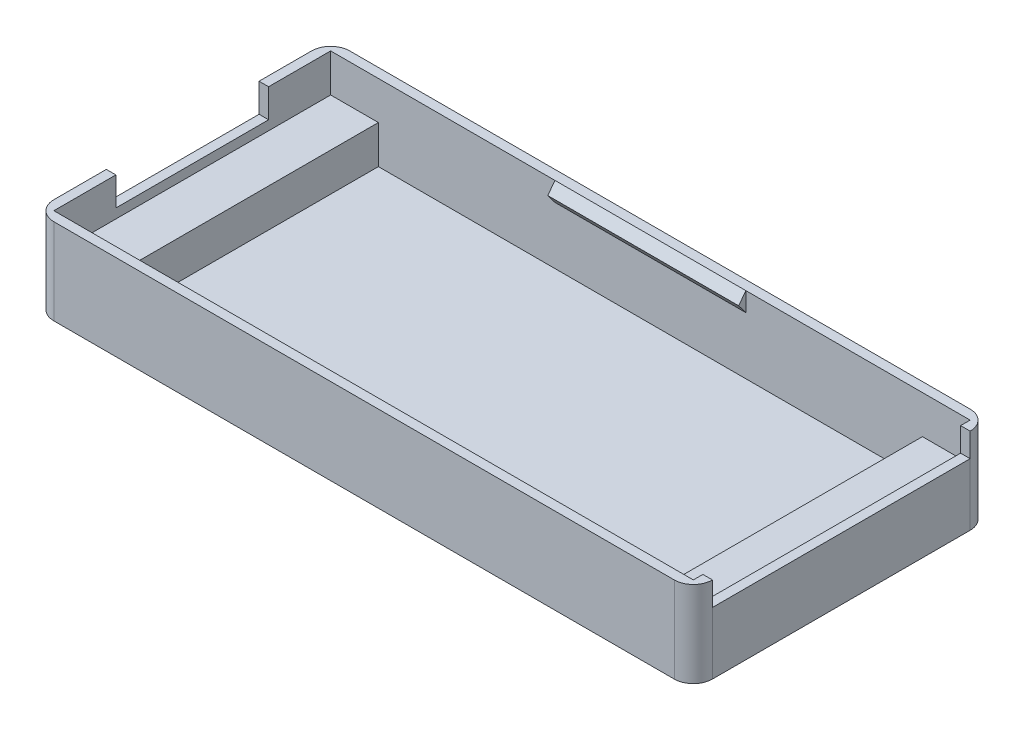
ISO-10303-21;
HEADER;
FILE_DESCRIPTION(('STEP AP214'),'2;1');
FILE_NAME('part.step','',(''),(''),'','','');
FILE_SCHEMA(('AUTOMOTIVE_DESIGN { 1 0 10303 214 1 1 1 1 }'));
ENDSEC;
DATA;
#1=APPLICATION_CONTEXT('core data for automotive mechanical design processes');
#2=APPLICATION_PROTOCOL_DEFINITION('international standard','automotive_design',2000,#1);
#3=PRODUCT_CONTEXT('',#1,'mechanical');
#4=PRODUCT('Part','Part','',(#3));
#5=PRODUCT_RELATED_PRODUCT_CATEGORY('part','',(#4));
#6=PRODUCT_DEFINITION_FORMATION('','',#4);
#7=PRODUCT_DEFINITION_CONTEXT('part definition',#1,'design');
#8=PRODUCT_DEFINITION('design','',#6,#7);
#9=PRODUCT_DEFINITION_SHAPE('','',#8);
#10=(LENGTH_UNIT() NAMED_UNIT(*) SI_UNIT(.MILLI.,.METRE.));
#11=(NAMED_UNIT(*) PLANE_ANGLE_UNIT() SI_UNIT($,.RADIAN.));
#12=(NAMED_UNIT(*) SI_UNIT($,.STERADIAN.) SOLID_ANGLE_UNIT());
#13=UNCERTAINTY_MEASURE_WITH_UNIT(LENGTH_MEASURE(1.E-05),#10,'distance_accuracy_value','');
#14=(GEOMETRIC_REPRESENTATION_CONTEXT(3) GLOBAL_UNCERTAINTY_ASSIGNED_CONTEXT((#13)) GLOBAL_UNIT_ASSIGNED_CONTEXT((#10,
#11,#12)) REPRESENTATION_CONTEXT('',''));
#15=CARTESIAN_POINT('',(0.,0.,0.));
#16=DIRECTION('',(0.,0.,1.));
#17=DIRECTION('',(1.,0.,0.));
#18=AXIS2_PLACEMENT_3D('',#15,#16,#17);
#19=CARTESIAN_POINT('',(-33.5,5.,-14.5));
#20=DIRECTION('',(0.,0.,-1.));
#21=DIRECTION('',(-1.,0.,0.));
#22=AXIS2_PLACEMENT_3D('',#19,#20,#21);
#23=PLANE('',#22);
#24=DIRECTION('',(0.,1.,0.));
#25=VECTOR('',#24,1.);
#26=CARTESIAN_POINT('',(10.,7.00000000000003,-14.5));
#27=LINE('',#26,#25);
#28=CARTESIAN_POINT('',(10.,7.00000000000003,-14.5));
#29=VERTEX_POINT('',#28);
#30=CARTESIAN_POINT('',(10.,9.,-14.5));
#31=VERTEX_POINT('',#30);
#32=EDGE_CURVE('E230',#29,#31,#27,.T.);
#33=ORIENTED_EDGE('',*,*,#32,.F.);
#34=DIRECTION('',(-1.,0.,0.));
#35=VECTOR('',#34,1.);
#36=CARTESIAN_POINT('',(10.,7.00000000000003,-14.5));
#37=LINE('',#36,#35);
#38=CARTESIAN_POINT('',(-10.,7.00000000000003,-14.5));
#39=VERTEX_POINT('',#38);
#40=EDGE_CURVE('E239',#29,#39,#37,.T.);
#41=ORIENTED_EDGE('',*,*,#40,.T.);
#42=DIRECTION('',(0.,1.,0.));
#43=VECTOR('',#42,1.);
#44=CARTESIAN_POINT('',(-10.,7.00000000000003,-14.5));
#45=LINE('',#44,#43);
#46=CARTESIAN_POINT('',(-10.,9.,-14.5));
#47=VERTEX_POINT('',#46);
#48=EDGE_CURVE('E256',#39,#47,#45,.T.);
#49=ORIENTED_EDGE('',*,*,#48,.T.);
#50=DIRECTION('',(-1.,0.,0.));
#51=VECTOR('',#50,1.);
#52=CARTESIAN_POINT('',(-33.5,9.,-14.5));
#53=LINE('',#52,#51);
#54=CARTESIAN_POINT('',(-33.5,9.,-14.5));
#55=VERTEX_POINT('',#54);
#56=EDGE_CURVE('E373',#47,#55,#53,.T.);
#57=ORIENTED_EDGE('',*,*,#56,.T.);
#58=DIRECTION('',(0.,1.,0.));
#59=VECTOR('',#58,1.);
#60=CARTESIAN_POINT('',(-33.5,5.,-14.5));
#61=LINE('',#60,#59);
#62=CARTESIAN_POINT('',(-33.5,5.,-14.5));
#63=VERTEX_POINT('',#62);
#64=EDGE_CURVE('E389',#63,#55,#61,.T.);
#65=ORIENTED_EDGE('',*,*,#64,.F.);
#66=DIRECTION('',(-1.,0.,0.));
#67=VECTOR('',#66,1.);
#68=CARTESIAN_POINT('',(-33.5,5.,-14.5));
#69=LINE('',#68,#67);
#70=CARTESIAN_POINT('',(-28.5,5.,-14.5));
#71=VERTEX_POINT('',#70);
#72=EDGE_CURVE('E357',#71,#63,#69,.T.);
#73=ORIENTED_EDGE('',*,*,#72,.F.);
#74=DIRECTION('',(0.,1.,0.));
#75=VECTOR('',#74,1.);
#76=CARTESIAN_POINT('',(-28.5,0.999999999999999,-14.5));
#77=LINE('',#76,#75);
#78=CARTESIAN_POINT('',(-28.5,0.999999999999999,-14.5));
#79=VERTEX_POINT('',#78);
#80=EDGE_CURVE('E326',#79,#71,#77,.T.);
#81=ORIENTED_EDGE('',*,*,#80,.F.);
#82=DIRECTION('',(-1.,0.,0.));
#83=VECTOR('',#82,1.);
#84=CARTESIAN_POINT('',(-28.5,0.999999999999999,-14.5));
#85=LINE('',#84,#83);
#86=CARTESIAN_POINT('',(28.5,0.999999999999999,-14.5));
#87=VERTEX_POINT('',#86);
#88=EDGE_CURVE('E318',#87,#79,#85,.T.);
#89=ORIENTED_EDGE('',*,*,#88,.F.);
#90=DIRECTION('',(0.,1.,0.));
#91=VECTOR('',#90,1.);
#92=CARTESIAN_POINT('',(28.5,0.999999999999999,-14.5));
#93=LINE('',#92,#91);
#94=CARTESIAN_POINT('',(28.5,5.,-14.5));
#95=VERTEX_POINT('',#94);
#96=EDGE_CURVE('E329',#87,#95,#93,.T.);
#97=ORIENTED_EDGE('',*,*,#96,.T.);
#98=CARTESIAN_POINT('',(33.5,5.,-14.5));
#99=VERTEX_POINT('',#98);
#100=EDGE_CURVE('E359',#99,#95,#69,.T.);
#101=ORIENTED_EDGE('',*,*,#100,.F.);
#102=DIRECTION('',(0.,1.,0.));
#103=VECTOR('',#102,1.);
#104=CARTESIAN_POINT('',(33.5,5.,-14.5));
#105=LINE('',#104,#103);
#106=CARTESIAN_POINT('',(33.5,9.,-14.5));
#107=VERTEX_POINT('',#106);
#108=EDGE_CURVE('E369',#99,#107,#105,.T.);
#109=ORIENTED_EDGE('',*,*,#108,.T.);
#110=EDGE_CURVE('E250',#107,#31,#53,.T.);
#111=ORIENTED_EDGE('',*,*,#110,.T.);
#112=EDGE_LOOP('',(#33,#41,#49,#57,#65,#73,#81,#89,#97,#101,#109,#111));
#113=FACE_BOUND('',#112,.T.);
#114=ADVANCED_FACE('F36',(#113),#23,.F.);
#115=CARTESIAN_POINT('',(-33.5,5.,14.5));
#116=DIRECTION('',(0.,0.,1.));
#117=DIRECTION('',(1.,0.,0.));
#118=AXIS2_PLACEMENT_3D('',#115,#116,#117);
#119=PLANE('',#118);
#120=DIRECTION('',(0.,-1.,0.));
#121=VECTOR('',#120,1.);
#122=CARTESIAN_POINT('',(10.,7.00000000000003,14.5));
#123=LINE('',#122,#121);
#124=CARTESIAN_POINT('',(10.,9.,14.5));
#125=VERTEX_POINT('',#124);
#126=CARTESIAN_POINT('',(10.,7.00000000000003,14.5));
#127=VERTEX_POINT('',#126);
#128=EDGE_CURVE('E263',#125,#127,#123,.T.);
#129=ORIENTED_EDGE('',*,*,#128,.F.);
#130=DIRECTION('',(1.,0.,0.));
#131=VECTOR('',#130,1.);
#132=CARTESIAN_POINT('',(-33.5,9.,14.5));
#133=LINE('',#132,#131);
#134=CARTESIAN_POINT('',(33.5,9.,14.5));
#135=VERTEX_POINT('',#134);
#136=EDGE_CURVE('E379',#125,#135,#133,.T.);
#137=ORIENTED_EDGE('',*,*,#136,.T.);
#138=DIRECTION('',(0.,1.,0.));
#139=VECTOR('',#138,1.);
#140=CARTESIAN_POINT('',(33.5,5.,14.5));
#141=LINE('',#140,#139);
#142=CARTESIAN_POINT('',(33.5,5.,14.5));
#143=VERTEX_POINT('',#142);
#144=EDGE_CURVE('E382',#143,#135,#141,.T.);
#145=ORIENTED_EDGE('',*,*,#144,.F.);
#146=DIRECTION('',(1.,0.,0.));
#147=VECTOR('',#146,1.);
#148=CARTESIAN_POINT('',(-33.5,5.,14.5));
#149=LINE('',#148,#147);
#150=CARTESIAN_POINT('',(28.5,5.,14.5));
#151=VERTEX_POINT('',#150);
#152=EDGE_CURVE('E365',#151,#143,#149,.T.);
#153=ORIENTED_EDGE('',*,*,#152,.F.);
#154=DIRECTION('',(0.,1.,0.));
#155=VECTOR('',#154,1.);
#156=CARTESIAN_POINT('',(28.5,0.999999999999999,14.5));
#157=LINE('',#156,#155);
#158=CARTESIAN_POINT('',(28.5,0.999999999999999,14.5));
#159=VERTEX_POINT('',#158);
#160=EDGE_CURVE('E331',#159,#151,#157,.T.);
#161=ORIENTED_EDGE('',*,*,#160,.F.);
#162=DIRECTION('',(1.,0.,0.));
#163=VECTOR('',#162,1.);
#164=CARTESIAN_POINT('',(-28.5,0.999999999999999,14.5));
#165=LINE('',#164,#163);
#166=CARTESIAN_POINT('',(-28.5,0.999999999999999,14.5));
#167=VERTEX_POINT('',#166);
#168=EDGE_CURVE('E311',#167,#159,#165,.T.);
#169=ORIENTED_EDGE('',*,*,#168,.F.);
#170=DIRECTION('',(0.,1.,0.));
#171=VECTOR('',#170,1.);
#172=CARTESIAN_POINT('',(-28.5,0.999999999999999,14.5));
#173=LINE('',#172,#171);
#174=CARTESIAN_POINT('',(-28.5,5.,14.5));
#175=VERTEX_POINT('',#174);
#176=EDGE_CURVE('E321',#167,#175,#173,.T.);
#177=ORIENTED_EDGE('',*,*,#176,.T.);
#178=CARTESIAN_POINT('',(-33.5,5.,14.5));
#179=VERTEX_POINT('',#178);
#180=EDGE_CURVE('E366',#179,#175,#149,.T.);
#181=ORIENTED_EDGE('',*,*,#180,.F.);
#182=DIRECTION('',(0.,1.,0.));
#183=VECTOR('',#182,1.);
#184=CARTESIAN_POINT('',(-33.5,5.,14.5));
#185=LINE('',#184,#183);
#186=CARTESIAN_POINT('',(-33.5,9.,14.5));
#187=VERTEX_POINT('',#186);
#188=EDGE_CURVE('E386',#179,#187,#185,.T.);
#189=ORIENTED_EDGE('',*,*,#188,.T.);
#190=CARTESIAN_POINT('',(-10.,9.,14.5));
#191=VERTEX_POINT('',#190);
#192=EDGE_CURVE('E358',#187,#191,#133,.T.);
#193=ORIENTED_EDGE('',*,*,#192,.T.);
#194=DIRECTION('',(0.,-1.,0.));
#195=VECTOR('',#194,1.);
#196=CARTESIAN_POINT('',(-10.,7.00000000000003,14.5));
#197=LINE('',#196,#195);
#198=CARTESIAN_POINT('',(-10.,7.00000000000003,14.5));
#199=VERTEX_POINT('',#198);
#200=EDGE_CURVE('E270',#191,#199,#197,.T.);
#201=ORIENTED_EDGE('',*,*,#200,.T.);
#202=DIRECTION('',(-1.,0.,0.));
#203=VECTOR('',#202,1.);
#204=CARTESIAN_POINT('',(10.,7.00000000000003,14.5));
#205=LINE('',#204,#203);
#206=EDGE_CURVE('E276',#127,#199,#205,.T.);
#207=ORIENTED_EDGE('',*,*,#206,.F.);
#208=EDGE_LOOP('',(#129,#137,#145,#153,#161,#169,#177,#181,#189,#193,#201,#207));
#209=FACE_BOUND('',#208,.T.);
#210=ADVANCED_FACE('F521',(#209),#119,.F.);
#211=CARTESIAN_POINT('',(-32.5,9.,13.5));
#212=DIRECTION('',(0.,-1.,0.));
#213=DIRECTION('',(0.,0.,-1.));
#214=AXIS2_PLACEMENT_3D('',#211,#212,#213);
#215=PLANE('',#214);
#216=DIRECTION('',(0.,0.,1.));
#217=VECTOR('',#216,1.);
#218=CARTESIAN_POINT('',(-33.5,9.,14.5));
#219=LINE('',#218,#217);
#220=CARTESIAN_POINT('',(-33.5,9.,8.));
#221=VERTEX_POINT('',#220);
#222=EDGE_CURVE('E375',#221,#187,#219,.T.);
#223=ORIENTED_EDGE('',*,*,#222,.F.);
#224=DIRECTION('',(1.,0.,0.));
#225=VECTOR('',#224,1.);
#226=CARTESIAN_POINT('',(-37.5,9.,8.));
#227=LINE('',#226,#225);
#228=CARTESIAN_POINT('',(-34.5,9.,8.));
#229=VERTEX_POINT('',#228);
#230=EDGE_CURVE('E289',#229,#221,#227,.T.);
#231=ORIENTED_EDGE('',*,*,#230,.F.);
#232=DIRECTION('',(0.,0.,1.));
#233=VECTOR('',#232,1.);
#234=CARTESIAN_POINT('',(-34.5,9.,13.5));
#235=LINE('',#234,#233);
#236=CARTESIAN_POINT('',(-34.5,9.,13.5));
#237=VERTEX_POINT('',#236);
#238=EDGE_CURVE('E408',#229,#237,#235,.T.);
#239=ORIENTED_EDGE('',*,*,#238,.T.);
#240=CARTESIAN_POINT('',(-32.5,9.,13.5));
#241=DIRECTION('',(0.,1.,0.));
#242=DIRECTION('',(0.,0.,-1.));
#243=AXIS2_PLACEMENT_3D('',#240,#241,#242);
#244=CIRCLE('',#243,2.);
#245=CARTESIAN_POINT('',(-32.5,9.,15.5));
#246=VERTEX_POINT('',#245);
#247=EDGE_CURVE('E393',#237,#246,#244,.T.);
#248=ORIENTED_EDGE('',*,*,#247,.T.);
#249=DIRECTION('',(1.,0.,0.));
#250=VECTOR('',#249,1.);
#251=CARTESIAN_POINT('',(-32.5,9.,15.5));
#252=LINE('',#251,#250);
#253=CARTESIAN_POINT('',(32.5,9.,15.5));
#254=VERTEX_POINT('',#253);
#255=EDGE_CURVE('E396',#246,#254,#252,.T.);
#256=ORIENTED_EDGE('',*,*,#255,.T.);
#257=CARTESIAN_POINT('',(32.5,9.,13.5));
#258=DIRECTION('',(0.,1.,0.));
#259=DIRECTION('',(0.,0.,1.));
#260=AXIS2_PLACEMENT_3D('',#257,#258,#259);
#261=CIRCLE('',#260,1.99999999999999);
#262=CARTESIAN_POINT('',(34.5,9.,13.5));
#263=VERTEX_POINT('',#262);
#264=EDGE_CURVE('E399',#254,#263,#261,.T.);
#265=ORIENTED_EDGE('',*,*,#264,.T.);
#266=DIRECTION('',(-1.,0.,0.));
#267=VECTOR('',#266,1.);
#268=CARTESIAN_POINT('',(52.5,9.,13.5));
#269=LINE('',#268,#267);
#270=CARTESIAN_POINT('',(33.5,9.,13.5));
#271=VERTEX_POINT('',#270);
#272=EDGE_CURVE('E344',#263,#271,#269,.T.);
#273=ORIENTED_EDGE('',*,*,#272,.T.);
#274=DIRECTION('',(0.,0.,-1.));
#275=VECTOR('',#274,1.);
#276=CARTESIAN_POINT('',(33.5,9.,14.5));
#277=LINE('',#276,#275);
#278=EDGE_CURVE('E370',#135,#271,#277,.T.);
#279=ORIENTED_EDGE('',*,*,#278,.F.);
#280=ORIENTED_EDGE('',*,*,#136,.F.);
#281=DIRECTION('',(-1.,0.,0.));
#282=VECTOR('',#281,1.);
#283=CARTESIAN_POINT('',(10.,9.,14.5));
#284=LINE('',#283,#282);
#285=EDGE_CURVE('E278',#125,#191,#284,.T.);
#286=ORIENTED_EDGE('',*,*,#285,.T.);
#287=ORIENTED_EDGE('',*,*,#192,.F.);
#288=EDGE_LOOP('',(#223,#231,#239,#248,#256,#265,#273,#279,#280,#286,#287));
#289=FACE_BOUND('',#288,.T.);
#290=ADVANCED_FACE('F479',(#289),#215,.F.);
#291=CARTESIAN_POINT('',(0.,5.,0.));
#292=DIRECTION('',(0.,-1.,0.));
#293=DIRECTION('',(0.,0.,-1.));
#294=AXIS2_PLACEMENT_3D('',#291,#292,#293);
#295=PLANE('',#294);
#296=DIRECTION('',(0.,0.,1.));
#297=VECTOR('',#296,1.);
#298=CARTESIAN_POINT('',(-28.5,5.,-14.5));
#299=LINE('',#298,#297);
#300=EDGE_CURVE('E307',#71,#175,#299,.T.);
#301=ORIENTED_EDGE('',*,*,#300,.F.);
#302=ORIENTED_EDGE('',*,*,#72,.T.);
#303=DIRECTION('',(0.,0.,1.));
#304=VECTOR('',#303,1.);
#305=CARTESIAN_POINT('',(-33.5,5.,14.5));
#306=LINE('',#305,#304);
#307=EDGE_CURVE('E362',#63,#179,#306,.T.);
#308=ORIENTED_EDGE('',*,*,#307,.T.);
#309=ORIENTED_EDGE('',*,*,#180,.T.);
#310=EDGE_LOOP('',(#301,#302,#308,#309));
#311=FACE_BOUND('',#310,.T.);
#312=ADVANCED_FACE('F535',(#311),#295,.F.);
#313=DIRECTION('',(0.,0.,-1.));
#314=VECTOR('',#313,1.);
#315=CARTESIAN_POINT('',(28.5,5.,-14.5));
#316=LINE('',#315,#314);
#317=EDGE_CURVE('E312',#151,#95,#316,.T.);
#318=ORIENTED_EDGE('',*,*,#317,.F.);
#319=ORIENTED_EDGE('',*,*,#152,.T.);
#320=DIRECTION('',(0.,0.,-1.));
#321=VECTOR('',#320,1.);
#322=CARTESIAN_POINT('',(33.5,5.,14.5));
#323=LINE('',#322,#321);
#324=EDGE_CURVE('E354',#143,#99,#323,.T.);
#325=ORIENTED_EDGE('',*,*,#324,.T.);
#326=ORIENTED_EDGE('',*,*,#100,.T.);
#327=EDGE_LOOP('',(#318,#319,#325,#326));
#328=FACE_BOUND('',#327,.T.);
#329=ADVANCED_FACE('F516',(#328),#295,.F.);
#330=CARTESIAN_POINT('',(-32.5,9.,13.5));
#331=DIRECTION('',(0.,-1.,0.));
#332=DIRECTION('',(0.,0.,-1.));
#333=AXIS2_PLACEMENT_3D('',#330,#331,#332);
#334=CYLINDRICAL_SURFACE('',#333,2.);
#335=CARTESIAN_POINT('',(-32.5,0.,13.5));
#336=DIRECTION('',(0.,1.,0.));
#337=DIRECTION('',(0.,0.,-1.));
#338=AXIS2_PLACEMENT_3D('',#335,#336,#337);
#339=CIRCLE('',#338,2.);
#340=CARTESIAN_POINT('',(-34.5,0.,13.5));
#341=VERTEX_POINT('',#340);
#342=CARTESIAN_POINT('',(-32.5,0.,15.5));
#343=VERTEX_POINT('',#342);
#344=EDGE_CURVE('E385',#341,#343,#339,.T.);
#345=ORIENTED_EDGE('',*,*,#344,.T.);
#346=DIRECTION('',(0.,-1.,0.));
#347=VECTOR('',#346,1.);
#348=CARTESIAN_POINT('',(-32.5,9.,15.5));
#349=LINE('',#348,#347);
#350=EDGE_CURVE('E11',#246,#343,#349,.T.);
#351=ORIENTED_EDGE('',*,*,#350,.F.);
#352=ORIENTED_EDGE('',*,*,#247,.F.);
#353=DIRECTION('',(0.,-1.,0.));
#354=VECTOR('',#353,1.);
#355=CARTESIAN_POINT('',(-34.5,9.,13.5));
#356=LINE('',#355,#354);
#357=EDGE_CURVE('E412',#237,#341,#356,.T.);
#358=ORIENTED_EDGE('',*,*,#357,.T.);
#359=EDGE_LOOP('',(#345,#351,#352,#358));
#360=FACE_BOUND('',#359,.T.);
#361=ADVANCED_FACE('F38',(#360),#334,.T.);
#362=CARTESIAN_POINT('',(-32.5,9.,15.5));
#363=DIRECTION('',(0.,0.,-1.));
#364=DIRECTION('',(-1.,0.,0.));
#365=AXIS2_PLACEMENT_3D('',#362,#363,#364);
#366=PLANE('',#365);
#367=DIRECTION('',(1.,0.,0.));
#368=VECTOR('',#367,1.);
#369=CARTESIAN_POINT('',(-32.5,0.,15.5));
#370=LINE('',#369,#368);
#371=CARTESIAN_POINT('',(32.5,0.,15.5));
#372=VERTEX_POINT('',#371);
#373=EDGE_CURVE('E415',#343,#372,#370,.T.);
#374=ORIENTED_EDGE('',*,*,#373,.T.);
#375=DIRECTION('',(0.,-1.,0.));
#376=VECTOR('',#375,1.);
#377=CARTESIAN_POINT('',(32.5,9.,15.5));
#378=LINE('',#377,#376);
#379=EDGE_CURVE('E44',#254,#372,#378,.T.);
#380=ORIENTED_EDGE('',*,*,#379,.F.);
#381=ORIENTED_EDGE('',*,*,#255,.F.);
#382=ORIENTED_EDGE('',*,*,#350,.T.);
#383=EDGE_LOOP('',(#374,#380,#381,#382));
#384=FACE_BOUND('',#383,.T.);
#385=ADVANCED_FACE('F483',(#384),#366,.F.);
#386=CARTESIAN_POINT('',(32.5,9.,13.5));
#387=DIRECTION('',(0.,-1.,0.));
#388=DIRECTION('',(0.,0.,-1.));
#389=AXIS2_PLACEMENT_3D('',#386,#387,#388);
#390=CYLINDRICAL_SURFACE('',#389,1.99999999999999);
#391=CARTESIAN_POINT('',(32.5,0.,13.5));
#392=DIRECTION('',(0.,1.,0.));
#393=DIRECTION('',(0.,0.,1.));
#394=AXIS2_PLACEMENT_3D('',#391,#392,#393);
#395=CIRCLE('',#394,1.99999999999999);
#396=CARTESIAN_POINT('',(34.5,0.,13.5));
#397=VERTEX_POINT('',#396);
#398=EDGE_CURVE('E417',#372,#397,#395,.T.);
#399=ORIENTED_EDGE('',*,*,#398,.T.);
#400=DIRECTION('',(0.,-1.,0.));
#401=VECTOR('',#400,1.);
#402=CARTESIAN_POINT('',(34.5,9.,13.5));
#403=LINE('',#402,#401);
#404=CARTESIAN_POINT('',(34.5,6.5,13.5));
#405=VERTEX_POINT('',#404);
#406=EDGE_CURVE('E445',#405,#397,#403,.T.);
#407=ORIENTED_EDGE('',*,*,#406,.F.);
#408=EDGE_CURVE('E446',#263,#405,#403,.T.);
#409=ORIENTED_EDGE('',*,*,#408,.F.);
#410=ORIENTED_EDGE('',*,*,#264,.F.);
#411=ORIENTED_EDGE('',*,*,#379,.T.);
#412=EDGE_LOOP('',(#399,#407,#409,#410,#411));
#413=FACE_BOUND('',#412,.T.);
#414=ADVANCED_FACE('F452',(#413),#390,.T.);
#415=CARTESIAN_POINT('',(34.5,9.,13.5));
#416=DIRECTION('',(-1.,0.,0.));
#417=DIRECTION('',(0.,0.,1.));
#418=AXIS2_PLACEMENT_3D('',#415,#416,#417);
#419=PLANE('',#418);
#420=DIRECTION('',(0.,-1.,0.));
#421=VECTOR('',#420,1.);
#422=CARTESIAN_POINT('',(34.5,9.,-13.5));
#423=LINE('',#422,#421);
#424=CARTESIAN_POINT('',(34.5,6.5,-13.5));
#425=VERTEX_POINT('',#424);
#426=CARTESIAN_POINT('',(34.5,0.,-13.5));
#427=VERTEX_POINT('',#426);
#428=EDGE_CURVE('E441',#425,#427,#423,.T.);
#429=ORIENTED_EDGE('',*,*,#428,.F.);
#430=DIRECTION('',(0.,0.,1.));
#431=VECTOR('',#430,1.);
#432=CARTESIAN_POINT('',(34.5,6.5,13.5));
#433=LINE('',#432,#431);
#434=EDGE_CURVE('E343',#425,#405,#433,.T.);
#435=ORIENTED_EDGE('',*,*,#434,.T.);
#436=ORIENTED_EDGE('',*,*,#406,.T.);
#437=DIRECTION('',(0.,0.,-1.));
#438=VECTOR('',#437,1.);
#439=CARTESIAN_POINT('',(34.5,0.,13.5));
#440=LINE('',#439,#438);
#441=EDGE_CURVE('E420',#397,#427,#440,.T.);
#442=ORIENTED_EDGE('',*,*,#441,.T.);
#443=EDGE_LOOP('',(#429,#435,#436,#442));
#444=FACE_BOUND('',#443,.T.);
#445=ADVANCED_FACE('F464',(#444),#419,.F.);
#446=CARTESIAN_POINT('',(32.5,9.,-13.5));
#447=DIRECTION('',(0.,-1.,0.));
#448=DIRECTION('',(0.,0.,-1.));
#449=AXIS2_PLACEMENT_3D('',#446,#447,#448);
#450=CYLINDRICAL_SURFACE('',#449,1.99999999999999);
#451=CARTESIAN_POINT('',(32.5,0.,-13.5));
#452=DIRECTION('',(0.,1.,0.));
#453=DIRECTION('',(0.,0.,-1.));
#454=AXIS2_PLACEMENT_3D('',#451,#452,#453);
#455=CIRCLE('',#454,1.99999999999999);
#456=CARTESIAN_POINT('',(32.5,0.,-15.5));
#457=VERTEX_POINT('',#456);
#458=EDGE_CURVE('E423',#427,#457,#455,.T.);
#459=ORIENTED_EDGE('',*,*,#458,.T.);
#460=DIRECTION('',(0.,-1.,0.));
#461=VECTOR('',#460,1.);
#462=CARTESIAN_POINT('',(32.5,9.,-15.5));
#463=LINE('',#462,#461);
#464=CARTESIAN_POINT('',(32.5,9.,-15.5));
#465=VERTEX_POINT('',#464);
#466=EDGE_CURVE('E438',#465,#457,#463,.T.);
#467=ORIENTED_EDGE('',*,*,#466,.F.);
#468=CARTESIAN_POINT('',(32.5,9.,-13.5));
#469=DIRECTION('',(0.,1.,0.));
#470=DIRECTION('',(0.,0.,-1.));
#471=AXIS2_PLACEMENT_3D('',#468,#469,#470);
#472=CIRCLE('',#471,1.99999999999999);
#473=CARTESIAN_POINT('',(34.5,9.,-13.5));
#474=VERTEX_POINT('',#473);
#475=EDGE_CURVE('E402',#474,#465,#472,.T.);
#476=ORIENTED_EDGE('',*,*,#475,.F.);
#477=EDGE_CURVE('E442',#474,#425,#423,.T.);
#478=ORIENTED_EDGE('',*,*,#477,.T.);
#479=ORIENTED_EDGE('',*,*,#428,.T.);
#480=EDGE_LOOP('',(#459,#467,#476,#478,#479));
#481=FACE_BOUND('',#480,.T.);
#482=ADVANCED_FACE('F503',(#481),#450,.T.);
#483=CARTESIAN_POINT('',(-32.5,9.,-15.5));
#484=DIRECTION('',(0.,0.,1.));
#485=DIRECTION('',(1.,0.,0.));
#486=AXIS2_PLACEMENT_3D('',#483,#484,#485);
#487=PLANE('',#486);
#488=DIRECTION('',(-1.,0.,0.));
#489=VECTOR('',#488,1.);
#490=CARTESIAN_POINT('',(-32.5,0.,-15.5));
#491=LINE('',#490,#489);
#492=CARTESIAN_POINT('',(-32.5,0.,-15.5));
#493=VERTEX_POINT('',#492);
#494=EDGE_CURVE('E425',#457,#493,#491,.T.);
#495=ORIENTED_EDGE('',*,*,#494,.T.);
#496=DIRECTION('',(0.,-1.,0.));
#497=VECTOR('',#496,1.);
#498=CARTESIAN_POINT('',(-32.5,9.,-15.5));
#499=LINE('',#498,#497);
#500=CARTESIAN_POINT('',(-32.5,9.,-15.5));
#501=VERTEX_POINT('',#500);
#502=EDGE_CURVE('E435',#501,#493,#499,.T.);
#503=ORIENTED_EDGE('',*,*,#502,.F.);
#504=DIRECTION('',(-1.,0.,0.));
#505=VECTOR('',#504,1.);
#506=CARTESIAN_POINT('',(-32.5,9.,-15.5));
#507=LINE('',#506,#505);
#508=EDGE_CURVE('E404',#465,#501,#507,.T.);
#509=ORIENTED_EDGE('',*,*,#508,.F.);
#510=ORIENTED_EDGE('',*,*,#466,.T.);
#511=EDGE_LOOP('',(#495,#503,#509,#510));
#512=FACE_BOUND('',#511,.T.);
#513=ADVANCED_FACE('F499',(#512),#487,.F.);
#514=CARTESIAN_POINT('',(-32.5,9.,-13.5));
#515=DIRECTION('',(0.,-1.,0.));
#516=DIRECTION('',(0.,0.,-1.));
#517=AXIS2_PLACEMENT_3D('',#514,#515,#516);
#518=CYLINDRICAL_SURFACE('',#517,2.);
#519=CARTESIAN_POINT('',(-32.5,0.,-13.5));
#520=DIRECTION('',(0.,1.,0.));
#521=DIRECTION('',(0.,0.,-1.));
#522=AXIS2_PLACEMENT_3D('',#519,#520,#521);
#523=CIRCLE('',#522,2.);
#524=CARTESIAN_POINT('',(-34.5,0.,-13.5));
#525=VERTEX_POINT('',#524);
#526=EDGE_CURVE('E427',#493,#525,#523,.T.);
#527=ORIENTED_EDGE('',*,*,#526,.T.);
#528=DIRECTION('',(0.,-1.,0.));
#529=VECTOR('',#528,1.);
#530=CARTESIAN_POINT('',(-34.5,9.,-13.5));
#531=LINE('',#530,#529);
#532=CARTESIAN_POINT('',(-34.5,9.,-13.5));
#533=VERTEX_POINT('',#532);
#534=EDGE_CURVE('E432',#533,#525,#531,.T.);
#535=ORIENTED_EDGE('',*,*,#534,.F.);
#536=CARTESIAN_POINT('',(-32.5,9.,-13.5));
#537=DIRECTION('',(0.,1.,0.));
#538=DIRECTION('',(0.,0.,-1.));
#539=AXIS2_PLACEMENT_3D('',#536,#537,#538);
#540=CIRCLE('',#539,2.);
#541=EDGE_CURVE('E406',#501,#533,#540,.T.);
#542=ORIENTED_EDGE('',*,*,#541,.F.);
#543=ORIENTED_EDGE('',*,*,#502,.T.);
#544=EDGE_LOOP('',(#527,#535,#542,#543));
#545=FACE_BOUND('',#544,.T.);
#546=ADVANCED_FACE('F495',(#545),#518,.T.);
#547=CARTESIAN_POINT('',(-34.5,9.,13.5));
#548=DIRECTION('',(1.,0.,0.));
#549=DIRECTION('',(0.,0.,-1.));
#550=AXIS2_PLACEMENT_3D('',#547,#548,#549);
#551=PLANE('',#550);
#552=ORIENTED_EDGE('',*,*,#238,.F.);
#553=DIRECTION('',(0.,-1.,0.));
#554=VECTOR('',#553,1.);
#555=CARTESIAN_POINT('',(-34.5,9.,8.));
#556=LINE('',#555,#554);
#557=CARTESIAN_POINT('',(-34.5,6.,8.));
#558=VERTEX_POINT('',#557);
#559=EDGE_CURVE('E304',#229,#558,#556,.T.);
#560=ORIENTED_EDGE('',*,*,#559,.T.);
#561=DIRECTION('',(0.,0.,-1.));
#562=VECTOR('',#561,1.);
#563=CARTESIAN_POINT('',(-34.5,6.,13.5));
#564=LINE('',#563,#562);
#565=CARTESIAN_POINT('',(-34.5,6.,-8.));
#566=VERTEX_POINT('',#565);
#567=EDGE_CURVE('E291',#558,#566,#564,.T.);
#568=ORIENTED_EDGE('',*,*,#567,.T.);
#569=DIRECTION('',(0.,1.,0.));
#570=VECTOR('',#569,1.);
#571=CARTESIAN_POINT('',(-34.5,9.,-8.));
#572=LINE('',#571,#570);
#573=CARTESIAN_POINT('',(-34.5,9.,-8.));
#574=VERTEX_POINT('',#573);
#575=EDGE_CURVE('E301',#566,#574,#572,.T.);
#576=ORIENTED_EDGE('',*,*,#575,.T.);
#577=EDGE_CURVE('E409',#533,#574,#235,.T.);
#578=ORIENTED_EDGE('',*,*,#577,.F.);
#579=ORIENTED_EDGE('',*,*,#534,.T.);
#580=DIRECTION('',(0.,0.,1.));
#581=VECTOR('',#580,1.);
#582=CARTESIAN_POINT('',(-34.5,0.,13.5));
#583=LINE('',#582,#581);
#584=EDGE_CURVE('E397',#525,#341,#583,.T.);
#585=ORIENTED_EDGE('',*,*,#584,.T.);
#586=ORIENTED_EDGE('',*,*,#357,.F.);
#587=EDGE_LOOP('',(#552,#560,#568,#576,#578,#579,#585,#586));
#588=FACE_BOUND('',#587,.T.);
#589=ADVANCED_FACE('F490',(#588),#551,.F.);
#590=ORIENTED_EDGE('',*,*,#577,.T.);
#591=DIRECTION('',(1.,0.,0.));
#592=VECTOR('',#591,1.);
#593=CARTESIAN_POINT('',(-37.5,9.,-8.));
#594=LINE('',#593,#592);
#595=CARTESIAN_POINT('',(-33.5,9.,-8.));
#596=VERTEX_POINT('',#595);
#597=EDGE_CURVE('E292',#574,#596,#594,.T.);
#598=ORIENTED_EDGE('',*,*,#597,.T.);
#599=EDGE_CURVE('E376',#55,#596,#219,.T.);
#600=ORIENTED_EDGE('',*,*,#599,.F.);
#601=ORIENTED_EDGE('',*,*,#56,.F.);
#602=DIRECTION('',(-1.,0.,0.));
#603=VECTOR('',#602,1.);
#604=CARTESIAN_POINT('',(10.,9.,-14.5));
#605=LINE('',#604,#603);
#606=EDGE_CURVE('E245',#31,#47,#605,.T.);
#607=ORIENTED_EDGE('',*,*,#606,.F.);
#608=ORIENTED_EDGE('',*,*,#110,.F.);
#609=CARTESIAN_POINT('',(33.5,9.,-13.5));
#610=VERTEX_POINT('',#609);
#611=EDGE_CURVE('E353',#610,#107,#277,.T.);
#612=ORIENTED_EDGE('',*,*,#611,.F.);
#613=DIRECTION('',(-1.,0.,0.));
#614=VECTOR('',#613,1.);
#615=CARTESIAN_POINT('',(52.5,9.,-13.5));
#616=LINE('',#615,#614);
#617=EDGE_CURVE('E341',#474,#610,#616,.T.);
#618=ORIENTED_EDGE('',*,*,#617,.F.);
#619=ORIENTED_EDGE('',*,*,#475,.T.);
#620=ORIENTED_EDGE('',*,*,#508,.T.);
#621=ORIENTED_EDGE('',*,*,#541,.T.);
#622=EDGE_LOOP('',(#590,#598,#600,#601,#607,#608,#612,#618,#619,#620,#621));
#623=FACE_BOUND('',#622,.T.);
#624=ADVANCED_FACE('F509',(#623),#215,.F.);
#625=CARTESIAN_POINT('',(-32.5,0.,13.5));
#626=DIRECTION('',(0.,-1.,0.));
#627=DIRECTION('',(0.,0.,-1.));
#628=AXIS2_PLACEMENT_3D('',#625,#626,#627);
#629=PLANE('',#628);
#630=ORIENTED_EDGE('',*,*,#344,.F.);
#631=ORIENTED_EDGE('',*,*,#584,.F.);
#632=ORIENTED_EDGE('',*,*,#526,.F.);
#633=ORIENTED_EDGE('',*,*,#494,.F.);
#634=ORIENTED_EDGE('',*,*,#458,.F.);
#635=ORIENTED_EDGE('',*,*,#441,.F.);
#636=ORIENTED_EDGE('',*,*,#398,.F.);
#637=ORIENTED_EDGE('',*,*,#373,.F.);
#638=EDGE_LOOP('',(#630,#631,#632,#633,#634,#635,#636,#637));
#639=FACE_BOUND('',#638,.T.);
#640=ADVANCED_FACE('F459',(#639),#629,.T.);
#641=CARTESIAN_POINT('',(33.5,5.,14.5));
#642=DIRECTION('',(1.,0.,0.));
#643=DIRECTION('',(0.,0.,-1.));
#644=AXIS2_PLACEMENT_3D('',#641,#642,#643);
#645=PLANE('',#644);
#646=DIRECTION('',(0.,0.,1.));
#647=VECTOR('',#646,1.);
#648=CARTESIAN_POINT('',(33.5,6.5,-13.5));
#649=LINE('',#648,#647);
#650=CARTESIAN_POINT('',(33.5,6.5,-13.5));
#651=VERTEX_POINT('',#650);
#652=CARTESIAN_POINT('',(33.5,6.5,13.5));
#653=VERTEX_POINT('',#652);
#654=EDGE_CURVE('E335',#651,#653,#649,.T.);
#655=ORIENTED_EDGE('',*,*,#654,.F.);
#656=DIRECTION('',(0.,-1.,0.));
#657=VECTOR('',#656,1.);
#658=CARTESIAN_POINT('',(33.5,9.,-13.5));
#659=LINE('',#658,#657);
#660=EDGE_CURVE('E328',#610,#651,#659,.T.);
#661=ORIENTED_EDGE('',*,*,#660,.F.);
#662=ORIENTED_EDGE('',*,*,#611,.T.);
#663=ORIENTED_EDGE('',*,*,#108,.F.);
#664=ORIENTED_EDGE('',*,*,#324,.F.);
#665=ORIENTED_EDGE('',*,*,#144,.T.);
#666=ORIENTED_EDGE('',*,*,#278,.T.);
#667=DIRECTION('',(0.,1.,0.));
#668=VECTOR('',#667,1.);
#669=CARTESIAN_POINT('',(33.5,9.,13.5));
#670=LINE('',#669,#668);
#671=EDGE_CURVE('E338',#653,#271,#670,.T.);
#672=ORIENTED_EDGE('',*,*,#671,.F.);
#673=EDGE_LOOP('',(#655,#661,#662,#663,#664,#665,#666,#672));
#674=FACE_BOUND('',#673,.T.);
#675=ADVANCED_FACE('F475',(#674),#645,.F.);
#676=CARTESIAN_POINT('',(-33.5,5.,14.5));
#677=DIRECTION('',(-1.,0.,0.));
#678=DIRECTION('',(0.,0.,1.));
#679=AXIS2_PLACEMENT_3D('',#676,#677,#678);
#680=PLANE('',#679);
#681=DIRECTION('',(0.,0.,-1.));
#682=VECTOR('',#681,1.);
#683=CARTESIAN_POINT('',(-33.5,6.,8.));
#684=LINE('',#683,#682);
#685=CARTESIAN_POINT('',(-33.5,6.,8.));
#686=VERTEX_POINT('',#685);
#687=CARTESIAN_POINT('',(-33.5,6.,-8.));
#688=VERTEX_POINT('',#687);
#689=EDGE_CURVE('E283',#686,#688,#684,.T.);
#690=ORIENTED_EDGE('',*,*,#689,.F.);
#691=DIRECTION('',(0.,-1.,0.));
#692=VECTOR('',#691,1.);
#693=CARTESIAN_POINT('',(-33.5,9.,8.));
#694=LINE('',#693,#692);
#695=EDGE_CURVE('E281',#221,#686,#694,.T.);
#696=ORIENTED_EDGE('',*,*,#695,.F.);
#697=ORIENTED_EDGE('',*,*,#222,.T.);
#698=ORIENTED_EDGE('',*,*,#188,.F.);
#699=ORIENTED_EDGE('',*,*,#307,.F.);
#700=ORIENTED_EDGE('',*,*,#64,.T.);
#701=ORIENTED_EDGE('',*,*,#599,.T.);
#702=DIRECTION('',(0.,1.,0.));
#703=VECTOR('',#702,1.);
#704=CARTESIAN_POINT('',(-33.5,9.,-8.));
#705=LINE('',#704,#703);
#706=EDGE_CURVE('E286',#688,#596,#705,.T.);
#707=ORIENTED_EDGE('',*,*,#706,.F.);
#708=EDGE_LOOP('',(#690,#696,#697,#698,#699,#700,#701,#707));
#709=FACE_BOUND('',#708,.T.);
#710=ADVANCED_FACE('F531',(#709),#680,.F.);
#711=CARTESIAN_POINT('',(52.5,9.,-13.5));
#712=DIRECTION('',(0.,0.,-1.));
#713=DIRECTION('',(-1.,0.,0.));
#714=AXIS2_PLACEMENT_3D('',#711,#712,#713);
#715=PLANE('',#714);
#716=ORIENTED_EDGE('',*,*,#617,.T.);
#717=ORIENTED_EDGE('',*,*,#660,.T.);
#718=DIRECTION('',(-1.,0.,0.));
#719=VECTOR('',#718,1.);
#720=CARTESIAN_POINT('',(52.5,6.5,-13.5));
#721=LINE('',#720,#719);
#722=EDGE_CURVE('E340',#425,#651,#721,.T.);
#723=ORIENTED_EDGE('',*,*,#722,.F.);
#724=ORIENTED_EDGE('',*,*,#477,.F.);
#725=EDGE_LOOP('',(#716,#717,#723,#724));
#726=FACE_BOUND('',#725,.T.);
#727=ADVANCED_FACE('F506',(#726),#715,.F.);
#728=CARTESIAN_POINT('',(52.5,9.,13.5));
#729=DIRECTION('',(0.,0.,1.));
#730=DIRECTION('',(1.,0.,0.));
#731=AXIS2_PLACEMENT_3D('',#728,#729,#730);
#732=PLANE('',#731);
#733=DIRECTION('',(-1.,0.,0.));
#734=VECTOR('',#733,1.);
#735=CARTESIAN_POINT('',(52.5,6.5,13.5));
#736=LINE('',#735,#734);
#737=EDGE_CURVE('E347',#405,#653,#736,.T.);
#738=ORIENTED_EDGE('',*,*,#737,.T.);
#739=ORIENTED_EDGE('',*,*,#671,.T.);
#740=ORIENTED_EDGE('',*,*,#272,.F.);
#741=ORIENTED_EDGE('',*,*,#408,.T.);
#742=EDGE_LOOP('',(#738,#739,#740,#741));
#743=FACE_BOUND('',#742,.T.);
#744=ADVANCED_FACE('F467',(#743),#732,.F.);
#745=CARTESIAN_POINT('',(52.5,6.5,-13.5));
#746=DIRECTION('',(0.,-1.,0.));
#747=DIRECTION('',(0.,0.,-1.));
#748=AXIS2_PLACEMENT_3D('',#745,#746,#747);
#749=PLANE('',#748);
#750=ORIENTED_EDGE('',*,*,#722,.T.);
#751=ORIENTED_EDGE('',*,*,#654,.T.);
#752=ORIENTED_EDGE('',*,*,#737,.F.);
#753=ORIENTED_EDGE('',*,*,#434,.F.);
#754=EDGE_LOOP('',(#750,#751,#752,#753));
#755=FACE_BOUND('',#754,.T.);
#756=ADVANCED_FACE('F469',(#755),#749,.F.);
#757=CARTESIAN_POINT('',(-28.5,0.999999999999999,-14.5));
#758=DIRECTION('',(-1.,0.,0.));
#759=DIRECTION('',(0.,0.,1.));
#760=AXIS2_PLACEMENT_3D('',#757,#758,#759);
#761=PLANE('',#760);
#762=ORIENTED_EDGE('',*,*,#300,.T.);
#763=ORIENTED_EDGE('',*,*,#176,.F.);
#764=DIRECTION('',(0.,0.,1.));
#765=VECTOR('',#764,1.);
#766=CARTESIAN_POINT('',(-28.5,0.999999999999999,-14.5));
#767=LINE('',#766,#765);
#768=EDGE_CURVE('E308',#79,#167,#767,.T.);
#769=ORIENTED_EDGE('',*,*,#768,.F.);
#770=ORIENTED_EDGE('',*,*,#80,.T.);
#771=EDGE_LOOP('',(#762,#763,#769,#770));
#772=FACE_BOUND('',#771,.T.);
#773=ADVANCED_FACE('F603',(#772),#761,.F.);
#774=CARTESIAN_POINT('',(28.5,0.999999999999999,-14.5));
#775=DIRECTION('',(1.,0.,0.));
#776=DIRECTION('',(0.,0.,-1.));
#777=AXIS2_PLACEMENT_3D('',#774,#775,#776);
#778=PLANE('',#777);
#779=ORIENTED_EDGE('',*,*,#317,.T.);
#780=ORIENTED_EDGE('',*,*,#96,.F.);
#781=DIRECTION('',(0.,0.,-1.));
#782=VECTOR('',#781,1.);
#783=CARTESIAN_POINT('',(28.5,0.999999999999999,-14.5));
#784=LINE('',#783,#782);
#785=EDGE_CURVE('E315',#159,#87,#784,.T.);
#786=ORIENTED_EDGE('',*,*,#785,.F.);
#787=ORIENTED_EDGE('',*,*,#160,.T.);
#788=EDGE_LOOP('',(#779,#780,#786,#787));
#789=FACE_BOUND('',#788,.T.);
#790=ADVANCED_FACE('F558',(#789),#778,.F.);
#791=CARTESIAN_POINT('',(0.,0.999999999999999,0.));
#792=DIRECTION('',(0.,1.,0.));
#793=DIRECTION('',(0.,0.,1.));
#794=AXIS2_PLACEMENT_3D('',#791,#792,#793);
#795=PLANE('',#794);
#796=ORIENTED_EDGE('',*,*,#768,.T.);
#797=ORIENTED_EDGE('',*,*,#168,.T.);
#798=ORIENTED_EDGE('',*,*,#785,.T.);
#799=ORIENTED_EDGE('',*,*,#88,.T.);
#800=EDGE_LOOP('',(#796,#797,#798,#799));
#801=FACE_BOUND('',#800,.T.);
#802=ADVANCED_FACE('F551',(#801),#795,.T.);
#803=CARTESIAN_POINT('',(-37.5,9.,8.));
#804=DIRECTION('',(0.,0.,1.));
#805=DIRECTION('',(1.,0.,0.));
#806=AXIS2_PLACEMENT_3D('',#803,#804,#805);
#807=PLANE('',#806);
#808=ORIENTED_EDGE('',*,*,#230,.T.);
#809=ORIENTED_EDGE('',*,*,#695,.T.);
#810=DIRECTION('',(1.,0.,0.));
#811=VECTOR('',#810,1.);
#812=CARTESIAN_POINT('',(-37.5,6.,8.));
#813=LINE('',#812,#811);
#814=EDGE_CURVE('E288',#558,#686,#813,.T.);
#815=ORIENTED_EDGE('',*,*,#814,.F.);
#816=ORIENTED_EDGE('',*,*,#559,.F.);
#817=EDGE_LOOP('',(#808,#809,#815,#816));
#818=FACE_BOUND('',#817,.T.);
#819=ADVANCED_FACE('F548',(#818),#807,.F.);
#820=CARTESIAN_POINT('',(-37.5,9.,-8.));
#821=DIRECTION('',(0.,0.,-1.));
#822=DIRECTION('',(-1.,0.,0.));
#823=AXIS2_PLACEMENT_3D('',#820,#821,#822);
#824=PLANE('',#823);
#825=DIRECTION('',(1.,0.,0.));
#826=VECTOR('',#825,1.);
#827=CARTESIAN_POINT('',(-37.5,6.,-8.));
#828=LINE('',#827,#826);
#829=EDGE_CURVE('E295',#566,#688,#828,.T.);
#830=ORIENTED_EDGE('',*,*,#829,.T.);
#831=ORIENTED_EDGE('',*,*,#706,.T.);
#832=ORIENTED_EDGE('',*,*,#597,.F.);
#833=ORIENTED_EDGE('',*,*,#575,.F.);
#834=EDGE_LOOP('',(#830,#831,#832,#833));
#835=FACE_BOUND('',#834,.T.);
#836=ADVANCED_FACE('F542',(#835),#824,.F.);
#837=CARTESIAN_POINT('',(-37.5,6.,8.));
#838=DIRECTION('',(0.,-1.,0.));
#839=DIRECTION('',(0.,0.,-1.));
#840=AXIS2_PLACEMENT_3D('',#837,#838,#839);
#841=PLANE('',#840);
#842=ORIENTED_EDGE('',*,*,#814,.T.);
#843=ORIENTED_EDGE('',*,*,#689,.T.);
#844=ORIENTED_EDGE('',*,*,#829,.F.);
#845=ORIENTED_EDGE('',*,*,#567,.F.);
#846=EDGE_LOOP('',(#842,#843,#844,#845));
#847=FACE_BOUND('',#846,.T.);
#848=ADVANCED_FACE('F546',(#847),#841,.F.);
#849=CARTESIAN_POINT('',(10.,9.,14.5));
#850=DIRECTION('',(0.,-0.6,0.8));
#851=DIRECTION('',(0.,-0.8,-0.6));
#852=AXIS2_PLACEMENT_3D('',#849,#850,#851);
#853=PLANE('',#852);
#854=DIRECTION('',(0.,0.8,0.6));
#855=VECTOR('',#854,1.);
#856=CARTESIAN_POINT('',(-10.,9.,14.5));
#857=LINE('',#856,#855);
#858=CARTESIAN_POINT('',(-10.,7.99999999999999,13.75));
#859=VERTEX_POINT('',#858);
#860=EDGE_CURVE('E244',#859,#191,#857,.T.);
#861=ORIENTED_EDGE('',*,*,#860,.T.);
#862=ORIENTED_EDGE('',*,*,#285,.F.);
#863=DIRECTION('',(0.,0.8,0.6));
#864=VECTOR('',#863,1.);
#865=CARTESIAN_POINT('',(10.,9.,14.5));
#866=LINE('',#865,#864);
#867=CARTESIAN_POINT('',(10.,7.99999999999999,13.75));
#868=VERTEX_POINT('',#867);
#869=EDGE_CURVE('E261',#868,#125,#866,.T.);
#870=ORIENTED_EDGE('',*,*,#869,.F.);
#871=DIRECTION('',(-1.,0.,0.));
#872=VECTOR('',#871,1.);
#873=CARTESIAN_POINT('',(10.,7.99999999999999,13.75));
#874=LINE('',#873,#872);
#875=EDGE_CURVE('E267',#868,#859,#874,.T.);
#876=ORIENTED_EDGE('',*,*,#875,.T.);
#877=EDGE_LOOP('',(#861,#862,#870,#876));
#878=FACE_BOUND('',#877,.T.);
#879=ADVANCED_FACE('F658',(#878),#853,.F.);
#880=CARTESIAN_POINT('',(10.,7.99999999999999,13.75));
#881=DIRECTION('',(0.,0.600000000000018,0.799999999999986));
#882=DIRECTION('',(0.,-0.799999999999986,0.600000000000018));
#883=AXIS2_PLACEMENT_3D('',#880,#881,#882);
#884=PLANE('',#883);
#885=DIRECTION('',(0.,0.799999999999986,-0.600000000000018));
#886=VECTOR('',#885,1.);
#887=CARTESIAN_POINT('',(-10.,7.99999999999999,13.75));
#888=LINE('',#887,#886);
#889=EDGE_CURVE('E59',#199,#859,#888,.T.);
#890=ORIENTED_EDGE('',*,*,#889,.T.);
#891=ORIENTED_EDGE('',*,*,#875,.F.);
#892=DIRECTION('',(0.,0.799999999999986,-0.600000000000018));
#893=VECTOR('',#892,1.);
#894=CARTESIAN_POINT('',(10.,7.99999999999999,13.75));
#895=LINE('',#894,#893);
#896=EDGE_CURVE('E265',#127,#868,#895,.T.);
#897=ORIENTED_EDGE('',*,*,#896,.F.);
#898=ORIENTED_EDGE('',*,*,#206,.T.);
#899=EDGE_LOOP('',(#890,#891,#897,#898));
#900=FACE_BOUND('',#899,.T.);
#901=ADVANCED_FACE('F691',(#900),#884,.F.);
#902=CARTESIAN_POINT('',(10.,0.,0.));
#903=DIRECTION('',(-1.,0.,0.));
#904=DIRECTION('',(0.,0.,1.));
#905=AXIS2_PLACEMENT_3D('',#902,#903,#904);
#906=PLANE('',#905);
#907=ORIENTED_EDGE('',*,*,#869,.T.);
#908=ORIENTED_EDGE('',*,*,#128,.T.);
#909=ORIENTED_EDGE('',*,*,#896,.T.);
#910=EDGE_LOOP('',(#907,#908,#909));
#911=FACE_BOUND('',#910,.T.);
#912=ADVANCED_FACE('F700',(#911),#906,.F.);
#913=CARTESIAN_POINT('',(-10.,0.,0.));
#914=DIRECTION('',(-1.,0.,0.));
#915=DIRECTION('',(0.,0.,1.));
#916=AXIS2_PLACEMENT_3D('',#913,#914,#915);
#917=PLANE('',#916);
#918=ORIENTED_EDGE('',*,*,#860,.F.);
#919=ORIENTED_EDGE('',*,*,#889,.F.);
#920=ORIENTED_EDGE('',*,*,#200,.F.);
#921=EDGE_LOOP('',(#918,#919,#920));
#922=FACE_BOUND('',#921,.T.);
#923=ADVANCED_FACE('F710',(#922),#917,.T.);
#924=CARTESIAN_POINT('',(10.,7.99999999999999,-13.75));
#925=DIRECTION('',(0.,0.600000000000018,-0.799999999999986));
#926=DIRECTION('',(0.,0.799999999999986,0.600000000000018));
#927=AXIS2_PLACEMENT_3D('',#924,#925,#926);
#928=PLANE('',#927);
#929=DIRECTION('',(0.,-0.799999999999986,-0.600000000000018));
#930=VECTOR('',#929,1.);
#931=CARTESIAN_POINT('',(-10.,7.99999999999999,-13.75));
#932=LINE('',#931,#930);
#933=CARTESIAN_POINT('',(-10.,7.99999999999999,-13.75));
#934=VERTEX_POINT('',#933);
#935=EDGE_CURVE('E241',#934,#39,#932,.T.);
#936=ORIENTED_EDGE('',*,*,#935,.T.);
#937=ORIENTED_EDGE('',*,*,#40,.F.);
#938=DIRECTION('',(0.,-0.799999999999986,-0.600000000000018));
#939=VECTOR('',#938,1.);
#940=CARTESIAN_POINT('',(10.,7.99999999999999,-13.75));
#941=LINE('',#940,#939);
#942=CARTESIAN_POINT('',(10.,7.99999999999999,-13.75));
#943=VERTEX_POINT('',#942);
#944=EDGE_CURVE('E226',#943,#29,#941,.T.);
#945=ORIENTED_EDGE('',*,*,#944,.F.);
#946=DIRECTION('',(-1.,0.,0.));
#947=VECTOR('',#946,1.);
#948=CARTESIAN_POINT('',(10.,7.99999999999999,-13.75));
#949=LINE('',#948,#947);
#950=EDGE_CURVE('E252',#943,#934,#949,.T.);
#951=ORIENTED_EDGE('',*,*,#950,.T.);
#952=EDGE_LOOP('',(#936,#937,#945,#951));
#953=FACE_BOUND('',#952,.T.);
#954=ADVANCED_FACE('F240',(#953),#928,.F.);
#955=CARTESIAN_POINT('',(10.,9.,-14.5));
#956=DIRECTION('',(0.,-0.6,-0.8));
#957=DIRECTION('',(0.,0.8,-0.6));
#958=AXIS2_PLACEMENT_3D('',#955,#956,#957);
#959=PLANE('',#958);
#960=DIRECTION('',(0.,-0.8,0.6));
#961=VECTOR('',#960,1.);
#962=CARTESIAN_POINT('',(-10.,9.,-14.5));
#963=LINE('',#962,#961);
#964=EDGE_CURVE('E51',#47,#934,#963,.T.);
#965=ORIENTED_EDGE('',*,*,#964,.T.);
#966=ORIENTED_EDGE('',*,*,#950,.F.);
#967=DIRECTION('',(0.,-0.8,0.6));
#968=VECTOR('',#967,1.);
#969=CARTESIAN_POINT('',(10.,9.,-14.5));
#970=LINE('',#969,#968);
#971=EDGE_CURVE('E232',#31,#943,#970,.T.);
#972=ORIENTED_EDGE('',*,*,#971,.F.);
#973=ORIENTED_EDGE('',*,*,#606,.T.);
#974=EDGE_LOOP('',(#965,#966,#972,#973));
#975=FACE_BOUND('',#974,.T.);
#976=ADVANCED_FACE('F728',(#975),#959,.F.);
#977=CARTESIAN_POINT('',(10.,0.,0.));
#978=DIRECTION('',(-1.,0.,0.));
#979=DIRECTION('',(0.,0.,1.));
#980=AXIS2_PLACEMENT_3D('',#977,#978,#979);
#981=PLANE('',#980);
#982=ORIENTED_EDGE('',*,*,#944,.T.);
#983=ORIENTED_EDGE('',*,*,#32,.T.);
#984=ORIENTED_EDGE('',*,*,#971,.T.);
#985=EDGE_LOOP('',(#982,#983,#984));
#986=FACE_BOUND('',#985,.T.);
#987=ADVANCED_FACE('F228',(#986),#981,.F.);
#988=CARTESIAN_POINT('',(-10.,0.,0.));
#989=DIRECTION('',(-1.,0.,0.));
#990=DIRECTION('',(0.,0.,1.));
#991=AXIS2_PLACEMENT_3D('',#988,#989,#990);
#992=PLANE('',#991);
#993=ORIENTED_EDGE('',*,*,#935,.F.);
#994=ORIENTED_EDGE('',*,*,#964,.F.);
#995=ORIENTED_EDGE('',*,*,#48,.F.);
#996=EDGE_LOOP('',(#993,#994,#995));
#997=FACE_BOUND('',#996,.T.);
#998=ADVANCED_FACE('F746',(#997),#992,.T.);
#999=CLOSED_SHELL('',(#114,#210,#290,#312,#329,#361,#385,#414,#445,#482,#513,#546,#589,#624,
#640,#675,#710,#727,#744,#756,#773,#790,#802,#819,#836,#848,#879,#901,#912,#923,#954,#976,#987,#998));
#1000=MANIFOLD_SOLID_BREP('B2',#999);
#1001=ADVANCED_BREP_SHAPE_REPRESENTATION('',(#18,#1000),#14);
#1002=SHAPE_DEFINITION_REPRESENTATION(#9,#1001);
ENDSEC;
END-ISO-10303-21;
